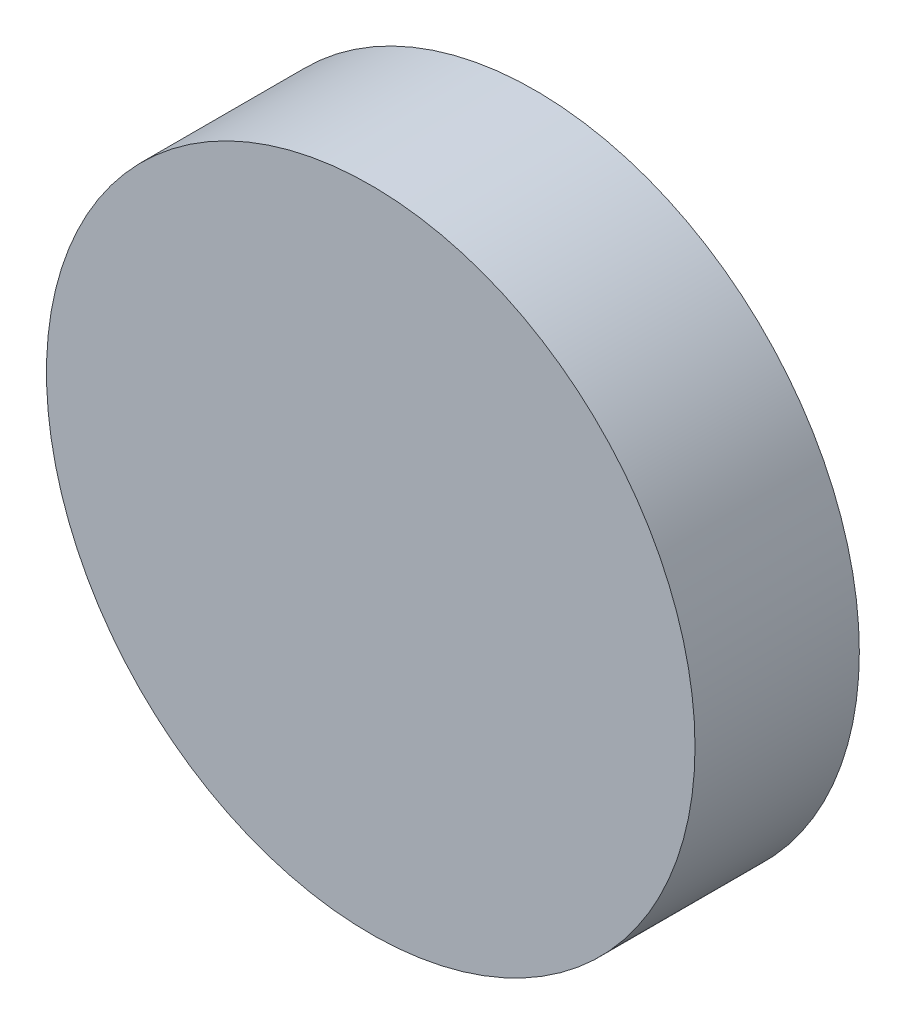
ISO-10303-21;
HEADER;
FILE_DESCRIPTION(('STEP AP214'),'2;1');
FILE_NAME('part.step','',(''),(''),'','','');
FILE_SCHEMA(('AUTOMOTIVE_DESIGN { 1 0 10303 214 1 1 1 1 }'));
ENDSEC;
DATA;
#1=APPLICATION_CONTEXT('core data for automotive mechanical design processes');
#2=APPLICATION_PROTOCOL_DEFINITION('international standard','automotive_design',2000,#1);
#3=PRODUCT_CONTEXT('',#1,'mechanical');
#4=PRODUCT('Part','Part','',(#3));
#5=PRODUCT_RELATED_PRODUCT_CATEGORY('part','',(#4));
#6=PRODUCT_DEFINITION_FORMATION('','',#4);
#7=PRODUCT_DEFINITION_CONTEXT('part definition',#1,'design');
#8=PRODUCT_DEFINITION('design','',#6,#7);
#9=PRODUCT_DEFINITION_SHAPE('','',#8);
#10=(LENGTH_UNIT() NAMED_UNIT(*) SI_UNIT(.MILLI.,.METRE.));
#11=(NAMED_UNIT(*) PLANE_ANGLE_UNIT() SI_UNIT($,.RADIAN.));
#12=(NAMED_UNIT(*) SI_UNIT($,.STERADIAN.) SOLID_ANGLE_UNIT());
#13=UNCERTAINTY_MEASURE_WITH_UNIT(LENGTH_MEASURE(1.E-05),#10,'distance_accuracy_value','');
#14=(GEOMETRIC_REPRESENTATION_CONTEXT(3) GLOBAL_UNCERTAINTY_ASSIGNED_CONTEXT((#13)) GLOBAL_UNIT_ASSIGNED_CONTEXT((#10,
#11,#12)) REPRESENTATION_CONTEXT('',''));
#15=CARTESIAN_POINT('',(0.,0.,0.));
#16=DIRECTION('',(0.,0.,1.));
#17=DIRECTION('',(1.,0.,0.));
#18=AXIS2_PLACEMENT_3D('',#15,#16,#17);
#19=CARTESIAN_POINT('',(-47.0347715476009,0.,10.));
#20=DIRECTION('',(0.,0.,-1.));
#21=DIRECTION('',(-1.,0.,0.));
#22=AXIS2_PLACEMENT_3D('',#19,#20,#21);
#23=CYLINDRICAL_SURFACE('',#22,19.7332148786693);
#24=CARTESIAN_POINT('',(-47.0347715476009,0.,10.));
#25=DIRECTION('',(0.,0.,1.));
#26=DIRECTION('',(1.,0.,0.));
#27=AXIS2_PLACEMENT_3D('',#24,#25,#26);
#28=CIRCLE('',#27,19.7332148786693);
#29=CARTESIAN_POINT('',(-27.3015566689317,0.,10.));
#30=VERTEX_POINT('',#29);
#31=EDGE_CURVE('E10',#30,#30,#28,.T.);
#32=ORIENTED_EDGE('',*,*,#31,.F.);
#33=EDGE_LOOP('',(#32));
#34=FACE_BOUND('',#33,.T.);
#35=CARTESIAN_POINT('',(-47.0347715476009,0.,0.));
#36=DIRECTION('',(0.,0.,1.));
#37=DIRECTION('',(1.,0.,0.));
#38=AXIS2_PLACEMENT_3D('',#35,#36,#37);
#39=CIRCLE('',#38,19.7332148786693);
#40=CARTESIAN_POINT('',(-27.3015566689317,0.,0.));
#41=VERTEX_POINT('',#40);
#42=EDGE_CURVE('E34',#41,#41,#39,.T.);
#43=ORIENTED_EDGE('',*,*,#42,.T.);
#44=EDGE_LOOP('',(#43));
#45=FACE_BOUND('',#44,.T.);
#46=ADVANCED_FACE('F31',(#34,#45),#23,.T.);
#47=CARTESIAN_POINT('',(-47.0347715476009,0.,10.));
#48=DIRECTION('',(0.,0.,1.));
#49=DIRECTION('',(1.,0.,0.));
#50=AXIS2_PLACEMENT_3D('',#47,#48,#49);
#51=PLANE('',#50);
#52=ORIENTED_EDGE('',*,*,#31,.T.);
#53=EDGE_LOOP('',(#52));
#54=FACE_BOUND('',#53,.T.);
#55=ADVANCED_FACE('F46',(#54),#51,.T.);
#56=CARTESIAN_POINT('',(-47.0347715476009,0.,0.));
#57=DIRECTION('',(0.,0.,1.));
#58=DIRECTION('',(1.,0.,0.));
#59=AXIS2_PLACEMENT_3D('',#56,#57,#58);
#60=PLANE('',#59);
#61=ORIENTED_EDGE('',*,*,#42,.F.);
#62=EDGE_LOOP('',(#61));
#63=FACE_BOUND('',#62,.T.);
#64=ADVANCED_FACE('F44',(#63),#60,.F.);
#65=CLOSED_SHELL('',(#46,#55,#64));
#66=MANIFOLD_SOLID_BREP('B2',#65);
#67=ADVANCED_BREP_SHAPE_REPRESENTATION('',(#18,#66),#14);
#68=SHAPE_DEFINITION_REPRESENTATION(#9,#67);
ENDSEC;
END-ISO-10303-21;
